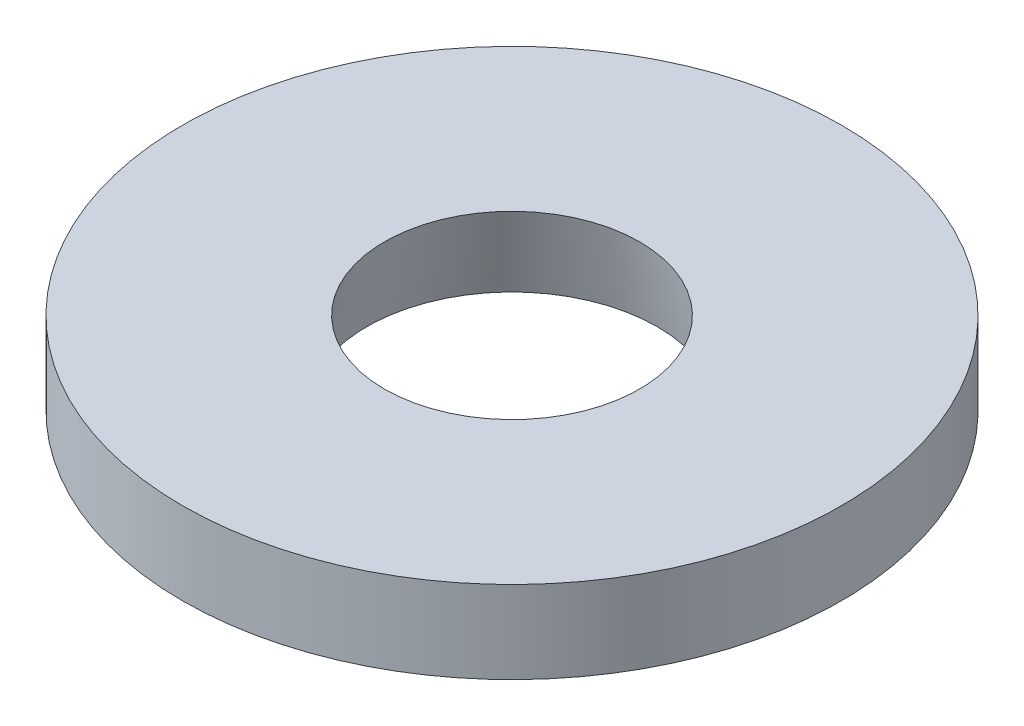
ISO-10303-21;
HEADER;
FILE_DESCRIPTION(('STEP AP214'),'2;1');
FILE_NAME('part.step','',(''),(''),'','','');
FILE_SCHEMA(('AUTOMOTIVE_DESIGN { 1 0 10303 214 1 1 1 1 }'));
ENDSEC;
DATA;
#1=APPLICATION_CONTEXT('core data for automotive mechanical design processes');
#2=APPLICATION_PROTOCOL_DEFINITION('international standard','automotive_design',2000,#1);
#3=PRODUCT_CONTEXT('',#1,'mechanical');
#4=PRODUCT('Part','Part','',(#3));
#5=PRODUCT_RELATED_PRODUCT_CATEGORY('part','',(#4));
#6=PRODUCT_DEFINITION_FORMATION('','',#4);
#7=PRODUCT_DEFINITION_CONTEXT('part definition',#1,'design');
#8=PRODUCT_DEFINITION('design','',#6,#7);
#9=PRODUCT_DEFINITION_SHAPE('','',#8);
#10=(LENGTH_UNIT() NAMED_UNIT(*) SI_UNIT(.MILLI.,.METRE.));
#11=(NAMED_UNIT(*) PLANE_ANGLE_UNIT() SI_UNIT($,.RADIAN.));
#12=(NAMED_UNIT(*) SI_UNIT($,.STERADIAN.) SOLID_ANGLE_UNIT());
#13=UNCERTAINTY_MEASURE_WITH_UNIT(LENGTH_MEASURE(1.E-05),#10,'distance_accuracy_value','');
#14=(GEOMETRIC_REPRESENTATION_CONTEXT(3) GLOBAL_UNCERTAINTY_ASSIGNED_CONTEXT((#13)) GLOBAL_UNIT_ASSIGNED_CONTEXT((#10,
#11,#12)) REPRESENTATION_CONTEXT('',''));
#15=CARTESIAN_POINT('',(0.,0.,0.));
#16=DIRECTION('',(0.,0.,1.));
#17=DIRECTION('',(1.,0.,0.));
#18=AXIS2_PLACEMENT_3D('',#15,#16,#17);
#19=CARTESIAN_POINT('',(0.,3.175,0.));
#20=DIRECTION('',(0.,1.,0.));
#21=DIRECTION('',(0.,0.,1.));
#22=AXIS2_PLACEMENT_3D('',#19,#20,#21);
#23=PLANE('',#22);
#24=CARTESIAN_POINT('',(0.,3.175,0.));
#25=DIRECTION('',(0.,1.,0.));
#26=DIRECTION('',(0.,0.,1.));
#27=AXIS2_PLACEMENT_3D('',#24,#25,#26);
#28=CIRCLE('',#27,4.91671428571427);
#29=CARTESIAN_POINT('',(0.,3.175,4.91671428571427));
#30=VERTEX_POINT('',#29);
#31=EDGE_CURVE('E47',#30,#30,#28,.T.);
#32=ORIENTED_EDGE('',*,*,#31,.F.);
#33=EDGE_LOOP('',(#32));
#34=FACE_BOUND('',#33,.T.);
#35=CARTESIAN_POINT('',(0.,3.175,0.));
#36=DIRECTION('',(0.,1.,0.));
#37=DIRECTION('',(0.,0.,1.));
#38=AXIS2_PLACEMENT_3D('',#35,#36,#37);
#39=CIRCLE('',#38,12.7);
#40=CARTESIAN_POINT('',(0.,3.175,12.7));
#41=VERTEX_POINT('',#40);
#42=EDGE_CURVE('E10',#41,#41,#39,.T.);
#43=ORIENTED_EDGE('',*,*,#42,.T.);
#44=EDGE_LOOP('',(#43));
#45=FACE_BOUND('',#44,.T.);
#46=ADVANCED_FACE('F34',(#34,#45),#23,.T.);
#47=CARTESIAN_POINT('',(0.,0.,0.));
#48=DIRECTION('',(0.,1.,0.));
#49=DIRECTION('',(0.,0.,1.));
#50=AXIS2_PLACEMENT_3D('',#47,#48,#49);
#51=PLANE('',#50);
#52=CARTESIAN_POINT('',(0.,0.,0.));
#53=DIRECTION('',(0.,1.,0.));
#54=DIRECTION('',(0.,0.,1.));
#55=AXIS2_PLACEMENT_3D('',#52,#53,#54);
#56=CIRCLE('',#55,5.59707142857138);
#57=CARTESIAN_POINT('',(0.,0.,5.59707142857138));
#58=VERTEX_POINT('',#57);
#59=EDGE_CURVE('E38',#58,#58,#56,.T.);
#60=ORIENTED_EDGE('',*,*,#59,.T.);
#61=EDGE_LOOP('',(#60));
#62=FACE_BOUND('',#61,.T.);
#63=CARTESIAN_POINT('',(0.,0.,0.));
#64=DIRECTION('',(0.,1.,0.));
#65=DIRECTION('',(0.,0.,1.));
#66=AXIS2_PLACEMENT_3D('',#63,#64,#65);
#67=CIRCLE('',#66,12.7);
#68=CARTESIAN_POINT('',(0.,0.,12.7));
#69=VERTEX_POINT('',#68);
#70=EDGE_CURVE('E42',#69,#69,#67,.T.);
#71=ORIENTED_EDGE('',*,*,#70,.F.);
#72=EDGE_LOOP('',(#71));
#73=FACE_BOUND('',#72,.T.);
#74=ADVANCED_FACE('F55',(#62,#73),#51,.F.);
#75=CARTESIAN_POINT('',(0.,3.175,0.));
#76=DIRECTION('',(0.,-1.,0.));
#77=DIRECTION('',(0.,0.,-1.));
#78=AXIS2_PLACEMENT_3D('',#75,#76,#77);
#79=CYLINDRICAL_SURFACE('',#78,12.7);
#80=ORIENTED_EDGE('',*,*,#42,.F.);
#81=EDGE_LOOP('',(#80));
#82=FACE_BOUND('',#81,.T.);
#83=ORIENTED_EDGE('',*,*,#70,.T.);
#84=EDGE_LOOP('',(#83));
#85=FACE_BOUND('',#84,.T.);
#86=ADVANCED_FACE('F36',(#82,#85),#79,.T.);
#87=CARTESIAN_POINT('',(0.,-1.5875,0.));
#88=DIRECTION('',(0.,-1.,0.));
#89=DIRECTION('',(0.,0.,-1.));
#90=AXIS2_PLACEMENT_3D('',#87,#88,#89);
#91=CONICAL_SURFACE('',#90,5.93724999999994,0.211093333222737);
#92=ORIENTED_EDGE('',*,*,#31,.T.);
#93=EDGE_LOOP('',(#92));
#94=FACE_BOUND('',#93,.T.);
#95=ORIENTED_EDGE('',*,*,#59,.F.);
#96=EDGE_LOOP('',(#95));
#97=FACE_BOUND('',#96,.T.);
#98=ADVANCED_FACE('F58',(#94,#97),#91,.F.);
#99=CLOSED_SHELL('',(#46,#74,#86,#98));
#100=MANIFOLD_SOLID_BREP('B2',#99);
#101=ADVANCED_BREP_SHAPE_REPRESENTATION('',(#18,#100),#14);
#102=SHAPE_DEFINITION_REPRESENTATION(#9,#101);
ENDSEC;
END-ISO-10303-21;
